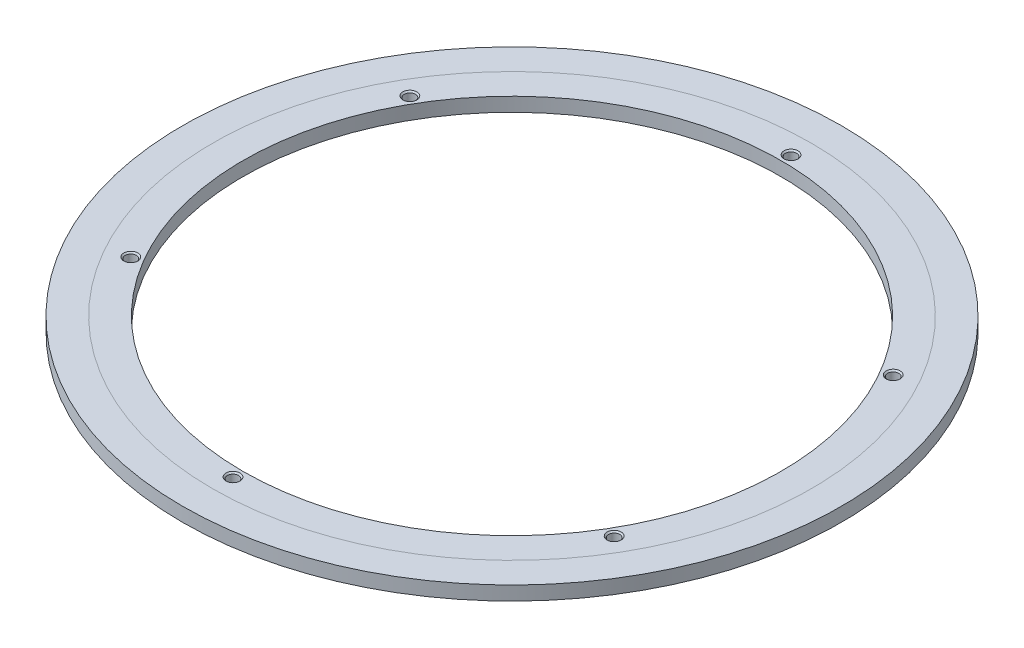
ISO-10303-21;
HEADER;
FILE_DESCRIPTION(('STEP AP214'),'2;1');
FILE_NAME('part.step','',(''),(''),'','','');
FILE_SCHEMA(('AUTOMOTIVE_DESIGN { 1 0 10303 214 1 1 1 1 }'));
ENDSEC;
DATA;
#1=APPLICATION_CONTEXT('core data for automotive mechanical design processes');
#2=APPLICATION_PROTOCOL_DEFINITION('international standard','automotive_design',2000,#1);
#3=PRODUCT_CONTEXT('',#1,'mechanical');
#4=PRODUCT('Part','Part','',(#3));
#5=PRODUCT_RELATED_PRODUCT_CATEGORY('part','',(#4));
#6=PRODUCT_DEFINITION_FORMATION('','',#4);
#7=PRODUCT_DEFINITION_CONTEXT('part definition',#1,'design');
#8=PRODUCT_DEFINITION('design','',#6,#7);
#9=PRODUCT_DEFINITION_SHAPE('','',#8);
#10=(LENGTH_UNIT() NAMED_UNIT(*) SI_UNIT(.MILLI.,.METRE.));
#11=(NAMED_UNIT(*) PLANE_ANGLE_UNIT() SI_UNIT($,.RADIAN.));
#12=(NAMED_UNIT(*) SI_UNIT($,.STERADIAN.) SOLID_ANGLE_UNIT());
#13=UNCERTAINTY_MEASURE_WITH_UNIT(LENGTH_MEASURE(1.E-05),#10,'distance_accuracy_value','');
#14=(GEOMETRIC_REPRESENTATION_CONTEXT(3) GLOBAL_UNCERTAINTY_ASSIGNED_CONTEXT((#13)) GLOBAL_UNIT_ASSIGNED_CONTEXT((#10,
#11,#12)) REPRESENTATION_CONTEXT('',''));
#15=CARTESIAN_POINT('',(0.,0.,0.));
#16=DIRECTION('',(0.,0.,1.));
#17=DIRECTION('',(1.,0.,0.));
#18=AXIS2_PLACEMENT_3D('',#15,#16,#17);
#19=CARTESIAN_POINT('',(0.,-6.35,0.));
#20=DIRECTION('',(0.,1.,0.));
#21=DIRECTION('',(0.,0.,1.));
#22=AXIS2_PLACEMENT_3D('',#19,#20,#21);
#23=CYLINDRICAL_SURFACE('',#22,136.25);
#24=CARTESIAN_POINT('',(0.,-6.35,0.));
#25=DIRECTION('',(0.,1.,0.));
#26=DIRECTION('',(0.,0.,1.));
#27=AXIS2_PLACEMENT_3D('',#24,#25,#26);
#28=CIRCLE('',#27,136.25);
#29=CARTESIAN_POINT('',(0.,-6.35,136.25));
#30=VERTEX_POINT('',#29);
#31=EDGE_CURVE('E56',#30,#30,#28,.T.);
#32=ORIENTED_EDGE('',*,*,#31,.T.);
#33=EDGE_LOOP('',(#32));
#34=FACE_BOUND('',#33,.T.);
#35=CARTESIAN_POINT('',(0.,0.,0.));
#36=DIRECTION('',(0.,1.,0.));
#37=DIRECTION('',(0.,0.,1.));
#38=AXIS2_PLACEMENT_3D('',#35,#36,#37);
#39=CIRCLE('',#38,136.25);
#40=CARTESIAN_POINT('',(0.,0.,136.25));
#41=VERTEX_POINT('',#40);
#42=EDGE_CURVE('E63',#41,#41,#39,.T.);
#43=ORIENTED_EDGE('',*,*,#42,.F.);
#44=EDGE_LOOP('',(#43));
#45=FACE_BOUND('',#44,.T.);
#46=ADVANCED_FACE('F49',(#34,#45),#23,.T.);
#47=CARTESIAN_POINT('',(0.,-6.35,0.));
#48=DIRECTION('',(0.,1.,0.));
#49=DIRECTION('',(0.,0.,1.));
#50=AXIS2_PLACEMENT_3D('',#47,#48,#49);
#51=CYLINDRICAL_SURFACE('',#50,122.5);
#52=CARTESIAN_POINT('',(0.,-6.35,0.));
#53=DIRECTION('',(0.,1.,0.));
#54=DIRECTION('',(0.,0.,1.));
#55=AXIS2_PLACEMENT_3D('',#52,#53,#54);
#56=CIRCLE('',#55,122.5);
#57=CARTESIAN_POINT('',(0.,-6.35,122.5));
#58=VERTEX_POINT('',#57);
#59=EDGE_CURVE('E11',#58,#58,#56,.T.);
#60=ORIENTED_EDGE('',*,*,#59,.F.);
#61=EDGE_LOOP('',(#60));
#62=FACE_BOUND('',#61,.T.);
#63=CARTESIAN_POINT('',(0.,0.,0.));
#64=DIRECTION('',(0.,1.,0.));
#65=DIRECTION('',(0.,0.,1.));
#66=AXIS2_PLACEMENT_3D('',#63,#64,#65);
#67=CIRCLE('',#66,122.5);
#68=CARTESIAN_POINT('',(0.,0.,122.5));
#69=VERTEX_POINT('',#68);
#70=EDGE_CURVE('E52',#69,#69,#67,.T.);
#71=ORIENTED_EDGE('',*,*,#70,.T.);
#72=EDGE_LOOP('',(#71));
#73=FACE_BOUND('',#72,.T.);
#74=ADVANCED_FACE('F182',(#62,#73),#51,.F.);
#75=CARTESIAN_POINT('',(0.,-6.35,0.));
#76=DIRECTION('',(0.,1.,0.));
#77=DIRECTION('',(0.,0.,1.));
#78=AXIS2_PLACEMENT_3D('',#75,#76,#77);
#79=PLANE('',#78);
#80=CARTESIAN_POINT('',(0.,-6.35,-127.));
#81=DIRECTION('',(0.,1.,0.));
#82=DIRECTION('',(0.,0.,1.));
#83=AXIS2_PLACEMENT_3D('',#80,#81,#82);
#84=CIRCLE('',#83,3.1877);
#85=CARTESIAN_POINT('',(0.,-6.35,-123.8123));
#86=VERTEX_POINT('',#85);
#87=EDGE_CURVE('E139',#86,#86,#84,.T.);
#88=ORIENTED_EDGE('',*,*,#87,.T.);
#89=EDGE_LOOP('',(#88));
#90=FACE_BOUND('',#89,.T.);
#91=CARTESIAN_POINT('',(109.985226280624,-6.35,-63.5));
#92=DIRECTION('',(0.,1.,0.));
#93=DIRECTION('',(0.,0.,1.));
#94=AXIS2_PLACEMENT_3D('',#91,#92,#93);
#95=CIRCLE('',#94,3.1877);
#96=CARTESIAN_POINT('',(109.985226280624,-6.35,-60.3123));
#97=VERTEX_POINT('',#96);
#98=EDGE_CURVE('E127',#97,#97,#95,.T.);
#99=ORIENTED_EDGE('',*,*,#98,.T.);
#100=EDGE_LOOP('',(#99));
#101=FACE_BOUND('',#100,.T.);
#102=CARTESIAN_POINT('',(109.985226280624,-6.35,63.5));
#103=DIRECTION('',(0.,1.,0.));
#104=DIRECTION('',(0.,0.,1.));
#105=AXIS2_PLACEMENT_3D('',#102,#103,#104);
#106=CIRCLE('',#105,3.1877);
#107=CARTESIAN_POINT('',(109.985226280624,-6.35,66.6877));
#108=VERTEX_POINT('',#107);
#109=EDGE_CURVE('E115',#108,#108,#106,.T.);
#110=ORIENTED_EDGE('',*,*,#109,.T.);
#111=EDGE_LOOP('',(#110));
#112=FACE_BOUND('',#111,.T.);
#113=CARTESIAN_POINT('',(0.,-6.35,127.));
#114=DIRECTION('',(0.,1.,0.));
#115=DIRECTION('',(0.,0.,1.));
#116=AXIS2_PLACEMENT_3D('',#113,#114,#115);
#117=CIRCLE('',#116,3.1877);
#118=CARTESIAN_POINT('',(0.,-6.35,130.1877));
#119=VERTEX_POINT('',#118);
#120=EDGE_CURVE('E103',#119,#119,#117,.T.);
#121=ORIENTED_EDGE('',*,*,#120,.T.);
#122=EDGE_LOOP('',(#121));
#123=FACE_BOUND('',#122,.T.);
#124=CARTESIAN_POINT('',(-109.985226280624,-6.35,63.5));
#125=DIRECTION('',(0.,1.,0.));
#126=DIRECTION('',(0.,0.,1.));
#127=AXIS2_PLACEMENT_3D('',#124,#125,#126);
#128=CIRCLE('',#127,3.1877);
#129=CARTESIAN_POINT('',(-109.985226280624,-6.35,66.6877));
#130=VERTEX_POINT('',#129);
#131=EDGE_CURVE('E91',#130,#130,#128,.T.);
#132=ORIENTED_EDGE('',*,*,#131,.T.);
#133=EDGE_LOOP('',(#132));
#134=FACE_BOUND('',#133,.T.);
#135=CARTESIAN_POINT('',(-109.985226280624,-6.35,-63.5));
#136=DIRECTION('',(0.,1.,0.));
#137=DIRECTION('',(0.,0.,1.));
#138=AXIS2_PLACEMENT_3D('',#135,#136,#137);
#139=CIRCLE('',#138,3.1877);
#140=CARTESIAN_POINT('',(-109.985226280624,-6.35,-60.3123));
#141=VERTEX_POINT('',#140);
#142=EDGE_CURVE('E79',#141,#141,#139,.T.);
#143=ORIENTED_EDGE('',*,*,#142,.T.);
#144=EDGE_LOOP('',(#143));
#145=FACE_BOUND('',#144,.T.);
#146=ORIENTED_EDGE('',*,*,#31,.F.);
#147=EDGE_LOOP('',(#146));
#148=FACE_BOUND('',#147,.T.);
#149=ORIENTED_EDGE('',*,*,#59,.T.);
#150=EDGE_LOOP('',(#149));
#151=FACE_BOUND('',#150,.T.);
#152=ADVANCED_FACE('F143',(#90,#101,#112,#123,#134,#145,#148,#151),#79,.F.);
#153=CARTESIAN_POINT('',(0.,0.,0.));
#154=DIRECTION('',(0.,1.,0.));
#155=DIRECTION('',(0.,0.,1.));
#156=AXIS2_PLACEMENT_3D('',#153,#154,#155);
#157=PLANE('',#156);
#158=CARTESIAN_POINT('',(0.,0.,-127.));
#159=DIRECTION('',(0.,1.,0.));
#160=DIRECTION('',(0.,0.,1.));
#161=AXIS2_PLACEMENT_3D('',#158,#159,#160);
#162=CIRCLE('',#161,3.1877);
#163=CARTESIAN_POINT('',(0.,0.,-123.8123));
#164=VERTEX_POINT('',#163);
#165=EDGE_CURVE('E136',#164,#164,#162,.T.);
#166=ORIENTED_EDGE('',*,*,#165,.F.);
#167=EDGE_LOOP('',(#166));
#168=FACE_BOUND('',#167,.T.);
#169=CARTESIAN_POINT('',(109.985226280624,0.,-63.5));
#170=DIRECTION('',(0.,1.,0.));
#171=DIRECTION('',(0.,0.,1.));
#172=AXIS2_PLACEMENT_3D('',#169,#170,#171);
#173=CIRCLE('',#172,3.1877);
#174=CARTESIAN_POINT('',(109.985226280624,0.,-60.3123));
#175=VERTEX_POINT('',#174);
#176=EDGE_CURVE('E124',#175,#175,#173,.T.);
#177=ORIENTED_EDGE('',*,*,#176,.F.);
#178=EDGE_LOOP('',(#177));
#179=FACE_BOUND('',#178,.T.);
#180=CARTESIAN_POINT('',(109.985226280624,0.,63.5));
#181=DIRECTION('',(0.,1.,0.));
#182=DIRECTION('',(0.,0.,1.));
#183=AXIS2_PLACEMENT_3D('',#180,#181,#182);
#184=CIRCLE('',#183,3.1877);
#185=CARTESIAN_POINT('',(109.985226280624,0.,66.6877));
#186=VERTEX_POINT('',#185);
#187=EDGE_CURVE('E112',#186,#186,#184,.T.);
#188=ORIENTED_EDGE('',*,*,#187,.F.);
#189=EDGE_LOOP('',(#188));
#190=FACE_BOUND('',#189,.T.);
#191=CARTESIAN_POINT('',(0.,0.,127.));
#192=DIRECTION('',(0.,1.,0.));
#193=DIRECTION('',(0.,0.,1.));
#194=AXIS2_PLACEMENT_3D('',#191,#192,#193);
#195=CIRCLE('',#194,3.1877);
#196=CARTESIAN_POINT('',(0.,0.,130.1877));
#197=VERTEX_POINT('',#196);
#198=EDGE_CURVE('E100',#197,#197,#195,.T.);
#199=ORIENTED_EDGE('',*,*,#198,.F.);
#200=EDGE_LOOP('',(#199));
#201=FACE_BOUND('',#200,.T.);
#202=CARTESIAN_POINT('',(-109.985226280624,0.,63.5));
#203=DIRECTION('',(0.,1.,0.));
#204=DIRECTION('',(0.,0.,1.));
#205=AXIS2_PLACEMENT_3D('',#202,#203,#204);
#206=CIRCLE('',#205,3.1877);
#207=CARTESIAN_POINT('',(-109.985226280624,0.,66.6877));
#208=VERTEX_POINT('',#207);
#209=EDGE_CURVE('E88',#208,#208,#206,.T.);
#210=ORIENTED_EDGE('',*,*,#209,.F.);
#211=EDGE_LOOP('',(#210));
#212=FACE_BOUND('',#211,.T.);
#213=CARTESIAN_POINT('',(-109.985226280624,0.,-63.5));
#214=DIRECTION('',(0.,1.,0.));
#215=DIRECTION('',(0.,0.,1.));
#216=AXIS2_PLACEMENT_3D('',#213,#214,#215);
#217=CIRCLE('',#216,3.1877);
#218=CARTESIAN_POINT('',(-109.985226280624,0.,-60.3123));
#219=VERTEX_POINT('',#218);
#220=EDGE_CURVE('E74',#219,#219,#217,.T.);
#221=ORIENTED_EDGE('',*,*,#220,.F.);
#222=EDGE_LOOP('',(#221));
#223=FACE_BOUND('',#222,.T.);
#224=ORIENTED_EDGE('',*,*,#42,.T.);
#225=EDGE_LOOP('',(#224));
#226=FACE_BOUND('',#225,.T.);
#227=ORIENTED_EDGE('',*,*,#70,.F.);
#228=EDGE_LOOP('',(#227));
#229=FACE_BOUND('',#228,.T.);
#230=ADVANCED_FACE('F165',(#168,#179,#190,#201,#212,#223,#226,#229),#157,.T.);
#231=CARTESIAN_POINT('',(-109.985226280624,-5.715,-63.5));
#232=DIRECTION('',(0.,-1.,0.));
#233=DIRECTION('',(0.,0.,-1.));
#234=AXIS2_PLACEMENT_3D('',#231,#232,#233);
#235=CONICAL_SURFACE('',#234,2.55270000000001,0.785398163397444);
#236=ORIENTED_EDGE('',*,*,#142,.F.);
#237=EDGE_LOOP('',(#236));
#238=FACE_BOUND('',#237,.T.);
#239=CARTESIAN_POINT('',(-109.985226280624,-5.715,-63.5));
#240=DIRECTION('',(0.,1.,0.));
#241=DIRECTION('',(0.,0.,1.));
#242=AXIS2_PLACEMENT_3D('',#239,#240,#241);
#243=CIRCLE('',#242,2.55270000000001);
#244=CARTESIAN_POINT('',(-109.985226280624,-5.715,-60.9473));
#245=VERTEX_POINT('',#244);
#246=EDGE_CURVE('E65',#245,#245,#243,.T.);
#247=ORIENTED_EDGE('',*,*,#246,.T.);
#248=EDGE_LOOP('',(#247));
#249=FACE_BOUND('',#248,.T.);
#250=ADVANCED_FACE('F168',(#238,#249),#235,.F.);
#251=CARTESIAN_POINT('',(-109.985226280624,0.,-63.5));
#252=DIRECTION('',(0.,1.,0.));
#253=DIRECTION('',(0.,0.,1.));
#254=AXIS2_PLACEMENT_3D('',#251,#252,#253);
#255=CYLINDRICAL_SURFACE('',#254,2.5527);
#256=ORIENTED_EDGE('',*,*,#246,.F.);
#257=EDGE_LOOP('',(#256));
#258=FACE_BOUND('',#257,.T.);
#259=CARTESIAN_POINT('',(-109.985226280624,-0.635000000000011,-63.5));
#260=DIRECTION('',(0.,1.,0.));
#261=DIRECTION('',(0.,0.,1.));
#262=AXIS2_PLACEMENT_3D('',#259,#260,#261);
#263=CIRCLE('',#262,2.55269999999999);
#264=CARTESIAN_POINT('',(-109.985226280624,-0.635000000000011,-60.9473));
#265=VERTEX_POINT('',#264);
#266=EDGE_CURVE('E70',#265,#265,#263,.T.);
#267=ORIENTED_EDGE('',*,*,#266,.T.);
#268=EDGE_LOOP('',(#267));
#269=FACE_BOUND('',#268,.T.);
#270=ADVANCED_FACE('F195',(#258,#269),#255,.F.);
#271=CARTESIAN_POINT('',(-109.985226280624,0.,-63.5));
#272=DIRECTION('',(0.,1.,0.));
#273=DIRECTION('',(0.,0.,1.));
#274=AXIS2_PLACEMENT_3D('',#271,#272,#273);
#275=CONICAL_SURFACE('',#274,3.1877,0.785398163397447);
#276=ORIENTED_EDGE('',*,*,#266,.F.);
#277=EDGE_LOOP('',(#276));
#278=FACE_BOUND('',#277,.T.);
#279=ORIENTED_EDGE('',*,*,#220,.T.);
#280=EDGE_LOOP('',(#279));
#281=FACE_BOUND('',#280,.T.);
#282=ADVANCED_FACE('F199',(#278,#281),#275,.F.);
#283=CARTESIAN_POINT('',(-109.985226280624,-5.715,63.5));
#284=DIRECTION('',(0.,-1.,0.));
#285=DIRECTION('',(0.,0.,-1.));
#286=AXIS2_PLACEMENT_3D('',#283,#284,#285);
#287=CONICAL_SURFACE('',#286,2.55270000000001,0.785398163397444);
#288=ORIENTED_EDGE('',*,*,#131,.F.);
#289=EDGE_LOOP('',(#288));
#290=FACE_BOUND('',#289,.T.);
#291=CARTESIAN_POINT('',(-109.985226280624,-5.715,63.5));
#292=DIRECTION('',(0.,1.,0.));
#293=DIRECTION('',(0.,0.,1.));
#294=AXIS2_PLACEMENT_3D('',#291,#292,#293);
#295=CIRCLE('',#294,2.55270000000001);
#296=CARTESIAN_POINT('',(-109.985226280624,-5.715,66.0527));
#297=VERTEX_POINT('',#296);
#298=EDGE_CURVE('E82',#297,#297,#295,.T.);
#299=ORIENTED_EDGE('',*,*,#298,.T.);
#300=EDGE_LOOP('',(#299));
#301=FACE_BOUND('',#300,.T.);
#302=ADVANCED_FACE('F203',(#290,#301),#287,.F.);
#303=CARTESIAN_POINT('',(-109.985226280624,0.,63.5));
#304=DIRECTION('',(0.,1.,0.));
#305=DIRECTION('',(0.,0.,1.));
#306=AXIS2_PLACEMENT_3D('',#303,#304,#305);
#307=CYLINDRICAL_SURFACE('',#306,2.5527);
#308=ORIENTED_EDGE('',*,*,#298,.F.);
#309=EDGE_LOOP('',(#308));
#310=FACE_BOUND('',#309,.T.);
#311=CARTESIAN_POINT('',(-109.985226280624,-0.635000000000011,63.5));
#312=DIRECTION('',(0.,1.,0.));
#313=DIRECTION('',(0.,0.,1.));
#314=AXIS2_PLACEMENT_3D('',#311,#312,#313);
#315=CIRCLE('',#314,2.55269999999999);
#316=CARTESIAN_POINT('',(-109.985226280624,-0.635000000000011,66.0527));
#317=VERTEX_POINT('',#316);
#318=EDGE_CURVE('E85',#317,#317,#315,.T.);
#319=ORIENTED_EDGE('',*,*,#318,.T.);
#320=EDGE_LOOP('',(#319));
#321=FACE_BOUND('',#320,.T.);
#322=ADVANCED_FACE('F207',(#310,#321),#307,.F.);
#323=CARTESIAN_POINT('',(-109.985226280624,0.,63.5));
#324=DIRECTION('',(0.,1.,0.));
#325=DIRECTION('',(0.,0.,1.));
#326=AXIS2_PLACEMENT_3D('',#323,#324,#325);
#327=CONICAL_SURFACE('',#326,3.1877,0.785398163397447);
#328=ORIENTED_EDGE('',*,*,#318,.F.);
#329=EDGE_LOOP('',(#328));
#330=FACE_BOUND('',#329,.T.);
#331=ORIENTED_EDGE('',*,*,#209,.T.);
#332=EDGE_LOOP('',(#331));
#333=FACE_BOUND('',#332,.T.);
#334=ADVANCED_FACE('F211',(#330,#333),#327,.F.);
#335=CARTESIAN_POINT('',(0.,-5.715,127.));
#336=DIRECTION('',(0.,-1.,0.));
#337=DIRECTION('',(0.,0.,-1.));
#338=AXIS2_PLACEMENT_3D('',#335,#336,#337);
#339=CONICAL_SURFACE('',#338,2.5527,0.785398163397446);
#340=ORIENTED_EDGE('',*,*,#120,.F.);
#341=EDGE_LOOP('',(#340));
#342=FACE_BOUND('',#341,.T.);
#343=CARTESIAN_POINT('',(0.,-5.715,127.));
#344=DIRECTION('',(0.,1.,0.));
#345=DIRECTION('',(0.,0.,1.));
#346=AXIS2_PLACEMENT_3D('',#343,#344,#345);
#347=CIRCLE('',#346,2.5527);
#348=CARTESIAN_POINT('',(0.,-5.715,129.5527));
#349=VERTEX_POINT('',#348);
#350=EDGE_CURVE('E94',#349,#349,#347,.T.);
#351=ORIENTED_EDGE('',*,*,#350,.T.);
#352=EDGE_LOOP('',(#351));
#353=FACE_BOUND('',#352,.T.);
#354=ADVANCED_FACE('F215',(#342,#353),#339,.F.);
#355=CARTESIAN_POINT('',(0.,0.,127.));
#356=DIRECTION('',(0.,1.,0.));
#357=DIRECTION('',(0.,0.,1.));
#358=AXIS2_PLACEMENT_3D('',#355,#356,#357);
#359=CYLINDRICAL_SURFACE('',#358,2.55269999999999);
#360=ORIENTED_EDGE('',*,*,#350,.F.);
#361=EDGE_LOOP('',(#360));
#362=FACE_BOUND('',#361,.T.);
#363=CARTESIAN_POINT('',(0.,-0.635000000000011,127.));
#364=DIRECTION('',(0.,1.,0.));
#365=DIRECTION('',(0.,0.,1.));
#366=AXIS2_PLACEMENT_3D('',#363,#364,#365);
#367=CIRCLE('',#366,2.55269999999999);
#368=CARTESIAN_POINT('',(0.,-0.635000000000011,129.5527));
#369=VERTEX_POINT('',#368);
#370=EDGE_CURVE('E97',#369,#369,#367,.T.);
#371=ORIENTED_EDGE('',*,*,#370,.T.);
#372=EDGE_LOOP('',(#371));
#373=FACE_BOUND('',#372,.T.);
#374=ADVANCED_FACE('F219',(#362,#373),#359,.F.);
#375=CARTESIAN_POINT('',(0.,0.,127.));
#376=DIRECTION('',(0.,1.,0.));
#377=DIRECTION('',(0.,0.,1.));
#378=AXIS2_PLACEMENT_3D('',#375,#376,#377);
#379=CONICAL_SURFACE('',#378,3.1877,0.785398163397448);
#380=ORIENTED_EDGE('',*,*,#370,.F.);
#381=EDGE_LOOP('',(#380));
#382=FACE_BOUND('',#381,.T.);
#383=ORIENTED_EDGE('',*,*,#198,.T.);
#384=EDGE_LOOP('',(#383));
#385=FACE_BOUND('',#384,.T.);
#386=ADVANCED_FACE('F223',(#382,#385),#379,.F.);
#387=CARTESIAN_POINT('',(109.985226280624,-5.715,63.5));
#388=DIRECTION('',(0.,-1.,0.));
#389=DIRECTION('',(0.,0.,-1.));
#390=AXIS2_PLACEMENT_3D('',#387,#388,#389);
#391=CONICAL_SURFACE('',#390,2.55270000000001,0.785398163397444);
#392=ORIENTED_EDGE('',*,*,#109,.F.);
#393=EDGE_LOOP('',(#392));
#394=FACE_BOUND('',#393,.T.);
#395=CARTESIAN_POINT('',(109.985226280624,-5.715,63.5));
#396=DIRECTION('',(0.,1.,0.));
#397=DIRECTION('',(0.,0.,1.));
#398=AXIS2_PLACEMENT_3D('',#395,#396,#397);
#399=CIRCLE('',#398,2.55270000000001);
#400=CARTESIAN_POINT('',(109.985226280624,-5.715,66.0527));
#401=VERTEX_POINT('',#400);
#402=EDGE_CURVE('E106',#401,#401,#399,.T.);
#403=ORIENTED_EDGE('',*,*,#402,.T.);
#404=EDGE_LOOP('',(#403));
#405=FACE_BOUND('',#404,.T.);
#406=ADVANCED_FACE('F227',(#394,#405),#391,.F.);
#407=CARTESIAN_POINT('',(109.985226280624,0.,63.5));
#408=DIRECTION('',(0.,1.,0.));
#409=DIRECTION('',(0.,0.,1.));
#410=AXIS2_PLACEMENT_3D('',#407,#408,#409);
#411=CYLINDRICAL_SURFACE('',#410,2.5527);
#412=ORIENTED_EDGE('',*,*,#402,.F.);
#413=EDGE_LOOP('',(#412));
#414=FACE_BOUND('',#413,.T.);
#415=CARTESIAN_POINT('',(109.985226280624,-0.635000000000011,63.5));
#416=DIRECTION('',(0.,1.,0.));
#417=DIRECTION('',(0.,0.,1.));
#418=AXIS2_PLACEMENT_3D('',#415,#416,#417);
#419=CIRCLE('',#418,2.55269999999999);
#420=CARTESIAN_POINT('',(109.985226280624,-0.635000000000011,66.0526999999999));
#421=VERTEX_POINT('',#420);
#422=EDGE_CURVE('E109',#421,#421,#419,.T.);
#423=ORIENTED_EDGE('',*,*,#422,.T.);
#424=EDGE_LOOP('',(#423));
#425=FACE_BOUND('',#424,.T.);
#426=ADVANCED_FACE('F231',(#414,#425),#411,.F.);
#427=CARTESIAN_POINT('',(109.985226280624,0.,63.5));
#428=DIRECTION('',(0.,1.,0.));
#429=DIRECTION('',(0.,0.,1.));
#430=AXIS2_PLACEMENT_3D('',#427,#428,#429);
#431=CONICAL_SURFACE('',#430,3.1877,0.785398163397447);
#432=ORIENTED_EDGE('',*,*,#422,.F.);
#433=EDGE_LOOP('',(#432));
#434=FACE_BOUND('',#433,.T.);
#435=ORIENTED_EDGE('',*,*,#187,.T.);
#436=EDGE_LOOP('',(#435));
#437=FACE_BOUND('',#436,.T.);
#438=ADVANCED_FACE('F235',(#434,#437),#431,.F.);
#439=CARTESIAN_POINT('',(109.985226280624,-5.715,-63.5));
#440=DIRECTION('',(0.,-1.,0.));
#441=DIRECTION('',(0.,0.,-1.));
#442=AXIS2_PLACEMENT_3D('',#439,#440,#441);
#443=CONICAL_SURFACE('',#442,2.55270000000001,0.785398163397444);
#444=ORIENTED_EDGE('',*,*,#98,.F.);
#445=EDGE_LOOP('',(#444));
#446=FACE_BOUND('',#445,.T.);
#447=CARTESIAN_POINT('',(109.985226280624,-5.715,-63.5));
#448=DIRECTION('',(0.,1.,0.));
#449=DIRECTION('',(0.,0.,1.));
#450=AXIS2_PLACEMENT_3D('',#447,#448,#449);
#451=CIRCLE('',#450,2.55270000000001);
#452=CARTESIAN_POINT('',(109.985226280624,-5.715,-60.9473));
#453=VERTEX_POINT('',#452);
#454=EDGE_CURVE('E118',#453,#453,#451,.T.);
#455=ORIENTED_EDGE('',*,*,#454,.T.);
#456=EDGE_LOOP('',(#455));
#457=FACE_BOUND('',#456,.T.);
#458=ADVANCED_FACE('F239',(#446,#457),#443,.F.);
#459=CARTESIAN_POINT('',(109.985226280624,0.,-63.5));
#460=DIRECTION('',(0.,1.,0.));
#461=DIRECTION('',(0.,0.,1.));
#462=AXIS2_PLACEMENT_3D('',#459,#460,#461);
#463=CYLINDRICAL_SURFACE('',#462,2.5527);
#464=ORIENTED_EDGE('',*,*,#454,.F.);
#465=EDGE_LOOP('',(#464));
#466=FACE_BOUND('',#465,.T.);
#467=CARTESIAN_POINT('',(109.985226280624,-0.635000000000011,-63.5));
#468=DIRECTION('',(0.,1.,0.));
#469=DIRECTION('',(0.,0.,1.));
#470=AXIS2_PLACEMENT_3D('',#467,#468,#469);
#471=CIRCLE('',#470,2.55269999999999);
#472=CARTESIAN_POINT('',(109.985226280624,-0.635000000000011,-60.9473));
#473=VERTEX_POINT('',#472);
#474=EDGE_CURVE('E121',#473,#473,#471,.T.);
#475=ORIENTED_EDGE('',*,*,#474,.T.);
#476=EDGE_LOOP('',(#475));
#477=FACE_BOUND('',#476,.T.);
#478=ADVANCED_FACE('F243',(#466,#477),#463,.F.);
#479=CARTESIAN_POINT('',(109.985226280624,0.,-63.5));
#480=DIRECTION('',(0.,1.,0.));
#481=DIRECTION('',(0.,0.,1.));
#482=AXIS2_PLACEMENT_3D('',#479,#480,#481);
#483=CONICAL_SURFACE('',#482,3.1877,0.785398163397447);
#484=ORIENTED_EDGE('',*,*,#474,.F.);
#485=EDGE_LOOP('',(#484));
#486=FACE_BOUND('',#485,.T.);
#487=ORIENTED_EDGE('',*,*,#176,.T.);
#488=EDGE_LOOP('',(#487));
#489=FACE_BOUND('',#488,.T.);
#490=ADVANCED_FACE('F150',(#486,#489),#483,.F.);
#491=CARTESIAN_POINT('',(0.,-5.715,-127.));
#492=DIRECTION('',(0.,-1.,0.));
#493=DIRECTION('',(0.,0.,-1.));
#494=AXIS2_PLACEMENT_3D('',#491,#492,#493);
#495=CONICAL_SURFACE('',#494,2.5527,0.785398163397447);
#496=ORIENTED_EDGE('',*,*,#87,.F.);
#497=EDGE_LOOP('',(#496));
#498=FACE_BOUND('',#497,.T.);
#499=CARTESIAN_POINT('',(0.,-5.715,-127.));
#500=DIRECTION('',(0.,1.,0.));
#501=DIRECTION('',(0.,0.,1.));
#502=AXIS2_PLACEMENT_3D('',#499,#500,#501);
#503=CIRCLE('',#502,2.5527);
#504=CARTESIAN_POINT('',(0.,-5.715,-124.4473));
#505=VERTEX_POINT('',#504);
#506=EDGE_CURVE('E130',#505,#505,#503,.T.);
#507=ORIENTED_EDGE('',*,*,#506,.T.);
#508=EDGE_LOOP('',(#507));
#509=FACE_BOUND('',#508,.T.);
#510=ADVANCED_FACE('F146',(#498,#509),#495,.F.);
#511=CARTESIAN_POINT('',(0.,0.,-127.));
#512=DIRECTION('',(0.,1.,0.));
#513=DIRECTION('',(0.,0.,1.));
#514=AXIS2_PLACEMENT_3D('',#511,#512,#513);
#515=CYLINDRICAL_SURFACE('',#514,2.55269999999999);
#516=ORIENTED_EDGE('',*,*,#506,.F.);
#517=EDGE_LOOP('',(#516));
#518=FACE_BOUND('',#517,.T.);
#519=CARTESIAN_POINT('',(0.,-0.635000000000011,-127.));
#520=DIRECTION('',(0.,1.,0.));
#521=DIRECTION('',(0.,0.,1.));
#522=AXIS2_PLACEMENT_3D('',#519,#520,#521);
#523=CIRCLE('',#522,2.55269999999999);
#524=CARTESIAN_POINT('',(0.,-0.635000000000011,-124.4473));
#525=VERTEX_POINT('',#524);
#526=EDGE_CURVE('E133',#525,#525,#523,.T.);
#527=ORIENTED_EDGE('',*,*,#526,.T.);
#528=EDGE_LOOP('',(#527));
#529=FACE_BOUND('',#528,.T.);
#530=ADVANCED_FACE('F149',(#518,#529),#515,.F.);
#531=CARTESIAN_POINT('',(0.,0.,-127.));
#532=DIRECTION('',(0.,1.,0.));
#533=DIRECTION('',(0.,0.,1.));
#534=AXIS2_PLACEMENT_3D('',#531,#532,#533);
#535=CONICAL_SURFACE('',#534,3.1877,0.785398163397448);
#536=ORIENTED_EDGE('',*,*,#526,.F.);
#537=EDGE_LOOP('',(#536));
#538=FACE_BOUND('',#537,.T.);
#539=ORIENTED_EDGE('',*,*,#165,.T.);
#540=EDGE_LOOP('',(#539));
#541=FACE_BOUND('',#540,.T.);
#542=ADVANCED_FACE('F156',(#538,#541),#535,.F.);
#543=CLOSED_SHELL('',(#46,#74,#152,#230,#250,#270,#282,#302,#322,#334,#354,#374,#386,#406,#426,
#438,#458,#478,#490,#510,#530,#542));
#544=MANIFOLD_SOLID_BREP('B2',#543);
#545=CARTESIAN_POINT('',(0.,-6.35,0.));
#546=DIRECTION('',(0.,1.,0.));
#547=DIRECTION('',(0.,0.,1.));
#548=AXIS2_PLACEMENT_3D('',#545,#546,#547);
#549=CYLINDRICAL_SURFACE('',#548,150.);
#550=CARTESIAN_POINT('',(0.,-6.35,0.));
#551=DIRECTION('',(0.,1.,0.));
#552=DIRECTION('',(0.,0.,1.));
#553=AXIS2_PLACEMENT_3D('',#550,#551,#552);
#554=CIRCLE('',#553,150.);
#555=CARTESIAN_POINT('',(0.,-6.35,150.));
#556=VERTEX_POINT('',#555);
#557=EDGE_CURVE('E511',#556,#556,#554,.T.);
#558=ORIENTED_EDGE('',*,*,#557,.T.);
#559=EDGE_LOOP('',(#558));
#560=FACE_BOUND('',#559,.T.);
#561=CARTESIAN_POINT('',(0.,0.,0.));
#562=DIRECTION('',(0.,1.,0.));
#563=DIRECTION('',(0.,0.,1.));
#564=AXIS2_PLACEMENT_3D('',#561,#562,#563);
#565=CIRCLE('',#564,150.);
#566=CARTESIAN_POINT('',(0.,0.,150.));
#567=VERTEX_POINT('',#566);
#568=EDGE_CURVE('E517',#567,#567,#565,.T.);
#569=ORIENTED_EDGE('',*,*,#568,.F.);
#570=EDGE_LOOP('',(#569));
#571=FACE_BOUND('',#570,.T.);
#572=ADVANCED_FACE('F504',(#560,#571),#549,.T.);
#573=CARTESIAN_POINT('',(0.,-6.35,0.));
#574=DIRECTION('',(0.,1.,0.));
#575=DIRECTION('',(0.,0.,1.));
#576=AXIS2_PLACEMENT_3D('',#573,#574,#575);
#577=CYLINDRICAL_SURFACE('',#576,136.25);
#578=CARTESIAN_POINT('',(0.,-6.35,0.));
#579=DIRECTION('',(0.,1.,0.));
#580=DIRECTION('',(0.,0.,1.));
#581=AXIS2_PLACEMENT_3D('',#578,#579,#580);
#582=CIRCLE('',#581,136.25);
#583=CARTESIAN_POINT('',(0.,-6.35,136.25));
#584=VERTEX_POINT('',#583);
#585=EDGE_CURVE('E48',#584,#584,#582,.T.);
#586=ORIENTED_EDGE('',*,*,#585,.F.);
#587=EDGE_LOOP('',(#586));
#588=FACE_BOUND('',#587,.T.);
#589=CARTESIAN_POINT('',(0.,0.,0.));
#590=DIRECTION('',(0.,1.,0.));
#591=DIRECTION('',(0.,0.,1.));
#592=AXIS2_PLACEMENT_3D('',#589,#590,#591);
#593=CIRCLE('',#592,136.25);
#594=CARTESIAN_POINT('',(0.,0.,136.25));
#595=VERTEX_POINT('',#594);
#596=EDGE_CURVE('E507',#595,#595,#593,.T.);
#597=ORIENTED_EDGE('',*,*,#596,.T.);
#598=EDGE_LOOP('',(#597));
#599=FACE_BOUND('',#598,.T.);
#600=ADVANCED_FACE('F524',(#588,#599),#577,.F.);
#601=CARTESIAN_POINT('',(0.,-6.35,0.));
#602=DIRECTION('',(0.,1.,0.));
#603=DIRECTION('',(0.,0.,1.));
#604=AXIS2_PLACEMENT_3D('',#601,#602,#603);
#605=PLANE('',#604);
#606=ORIENTED_EDGE('',*,*,#557,.F.);
#607=EDGE_LOOP('',(#606));
#608=FACE_BOUND('',#607,.T.);
#609=ORIENTED_EDGE('',*,*,#585,.T.);
#610=EDGE_LOOP('',(#609));
#611=FACE_BOUND('',#610,.T.);
#612=ADVANCED_FACE('F528',(#608,#611),#605,.F.);
#613=CARTESIAN_POINT('',(0.,0.,0.));
#614=DIRECTION('',(0.,1.,0.));
#615=DIRECTION('',(0.,0.,1.));
#616=AXIS2_PLACEMENT_3D('',#613,#614,#615);
#617=PLANE('',#616);
#618=ORIENTED_EDGE('',*,*,#568,.T.);
#619=EDGE_LOOP('',(#618));
#620=FACE_BOUND('',#619,.T.);
#621=ORIENTED_EDGE('',*,*,#596,.F.);
#622=EDGE_LOOP('',(#621));
#623=FACE_BOUND('',#622,.T.);
#624=ADVANCED_FACE('F526',(#620,#623),#617,.T.);
#625=CLOSED_SHELL('',(#572,#600,#612,#624));
#626=MANIFOLD_SOLID_BREP('B6',#625);
#627=ADVANCED_BREP_SHAPE_REPRESENTATION('',(#18,#544,#626),#14);
#628=SHAPE_DEFINITION_REPRESENTATION(#9,#627);
ENDSEC;
END-ISO-10303-21;
